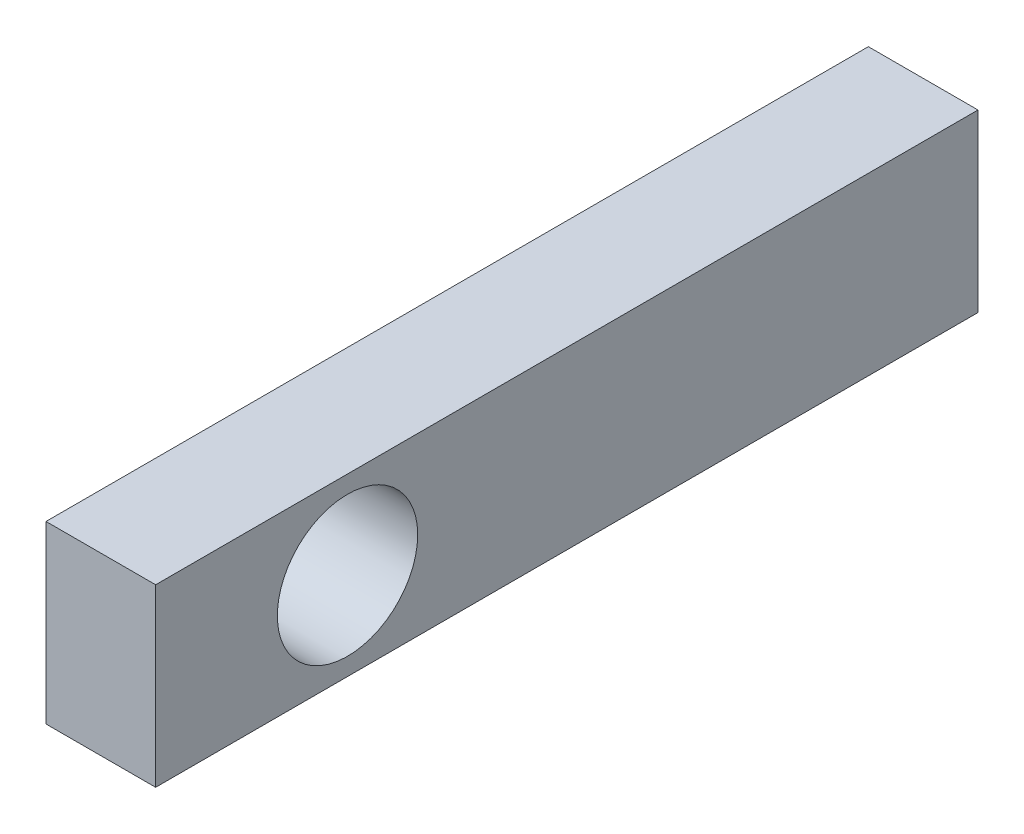
ISO-10303-21;
HEADER;
FILE_DESCRIPTION(('STEP AP214'),'2;1');
FILE_NAME('part.step','',(''),(''),'','','');
FILE_SCHEMA(('AUTOMOTIVE_DESIGN { 1 0 10303 214 1 1 1 1 }'));
ENDSEC;
DATA;
#1=APPLICATION_CONTEXT('core data for automotive mechanical design processes');
#2=APPLICATION_PROTOCOL_DEFINITION('international standard','automotive_design',2000,#1);
#3=PRODUCT_CONTEXT('',#1,'mechanical');
#4=PRODUCT('Part','Part','',(#3));
#5=PRODUCT_RELATED_PRODUCT_CATEGORY('part','',(#4));
#6=PRODUCT_DEFINITION_FORMATION('','',#4);
#7=PRODUCT_DEFINITION_CONTEXT('part definition',#1,'design');
#8=PRODUCT_DEFINITION('design','',#6,#7);
#9=PRODUCT_DEFINITION_SHAPE('','',#8);
#10=(LENGTH_UNIT() NAMED_UNIT(*) SI_UNIT(.MILLI.,.METRE.));
#11=(NAMED_UNIT(*) PLANE_ANGLE_UNIT() SI_UNIT($,.RADIAN.));
#12=(NAMED_UNIT(*) SI_UNIT($,.STERADIAN.) SOLID_ANGLE_UNIT());
#13=UNCERTAINTY_MEASURE_WITH_UNIT(LENGTH_MEASURE(1.E-05),#10,'distance_accuracy_value','');
#14=(GEOMETRIC_REPRESENTATION_CONTEXT(3) GLOBAL_UNCERTAINTY_ASSIGNED_CONTEXT((#13)) GLOBAL_UNIT_ASSIGNED_CONTEXT((#10,
#11,#12)) REPRESENTATION_CONTEXT('',''));
#15=CARTESIAN_POINT('',(0.,0.,0.));
#16=DIRECTION('',(0.,0.,1.));
#17=DIRECTION('',(1.,0.,0.));
#18=AXIS2_PLACEMENT_3D('',#15,#16,#17);
#19=CARTESIAN_POINT('',(0.,84.,57.));
#20=DIRECTION('',(1.,0.,0.));
#21=DIRECTION('',(0.,0.,-1.));
#22=AXIS2_PLACEMENT_3D('',#19,#20,#21);
#23=PLANE('',#22);
#24=CARTESIAN_POINT('',(0.,80.8,50.));
#25=DIRECTION('',(1.,0.,0.));
#26=DIRECTION('',(0.,0.,-1.));
#27=AXIS2_PLACEMENT_3D('',#24,#25,#26);
#28=CIRCLE('',#27,2.56);
#29=CARTESIAN_POINT('',(0.,80.8,47.44));
#30=VERTEX_POINT('',#29);
#31=EDGE_CURVE('E116',#30,#30,#28,.T.);
#32=ORIENTED_EDGE('',*,*,#31,.T.);
#33=EDGE_LOOP('',(#32));
#34=FACE_BOUND('',#33,.T.);
#35=DIRECTION('',(0.,-1.,0.));
#36=VECTOR('',#35,1.);
#37=CARTESIAN_POINT('',(0.,84.,27.));
#38=LINE('',#37,#36);
#39=CARTESIAN_POINT('',(0.,84.,27.));
#40=VERTEX_POINT('',#39);
#41=CARTESIAN_POINT('',(0.,77.6,27.));
#42=VERTEX_POINT('',#41);
#43=EDGE_CURVE('E105',#40,#42,#38,.T.);
#44=ORIENTED_EDGE('',*,*,#43,.T.);
#45=DIRECTION('',(0.,0.,-1.));
#46=VECTOR('',#45,1.);
#47=CARTESIAN_POINT('',(0.,77.6,57.));
#48=LINE('',#47,#46);
#49=CARTESIAN_POINT('',(0.,77.6,57.));
#50=VERTEX_POINT('',#49);
#51=EDGE_CURVE('E11',#50,#42,#48,.T.);
#52=ORIENTED_EDGE('',*,*,#51,.F.);
#53=DIRECTION('',(0.,-1.,0.));
#54=VECTOR('',#53,1.);
#55=CARTESIAN_POINT('',(0.,84.,57.));
#56=LINE('',#55,#54);
#57=CARTESIAN_POINT('',(0.,84.,57.));
#58=VERTEX_POINT('',#57);
#59=EDGE_CURVE('E88',#58,#50,#56,.T.);
#60=ORIENTED_EDGE('',*,*,#59,.F.);
#61=DIRECTION('',(0.,0.,-1.));
#62=VECTOR('',#61,1.);
#63=CARTESIAN_POINT('',(0.,84.,57.));
#64=LINE('',#63,#62);
#65=EDGE_CURVE('E96',#58,#40,#64,.T.);
#66=ORIENTED_EDGE('',*,*,#65,.T.);
#67=EDGE_LOOP('',(#44,#52,#60,#66));
#68=FACE_BOUND('',#67,.T.);
#69=ADVANCED_FACE('F39',(#34,#68),#23,.F.);
#70=CARTESIAN_POINT('',(0.,77.6,57.));
#71=DIRECTION('',(0.,1.,0.));
#72=DIRECTION('',(0.,0.,1.));
#73=AXIS2_PLACEMENT_3D('',#70,#71,#72);
#74=PLANE('',#73);
#75=DIRECTION('',(1.,0.,0.));
#76=VECTOR('',#75,1.);
#77=CARTESIAN_POINT('',(0.,77.6,27.));
#78=LINE('',#77,#76);
#79=CARTESIAN_POINT('',(4.,77.6,27.));
#80=VERTEX_POINT('',#79);
#81=EDGE_CURVE('E92',#42,#80,#78,.T.);
#82=ORIENTED_EDGE('',*,*,#81,.T.);
#83=DIRECTION('',(0.,0.,-1.));
#84=VECTOR('',#83,1.);
#85=CARTESIAN_POINT('',(4.,77.6,57.));
#86=LINE('',#85,#84);
#87=CARTESIAN_POINT('',(4.,77.6,57.));
#88=VERTEX_POINT('',#87);
#89=EDGE_CURVE('E50',#88,#80,#86,.T.);
#90=ORIENTED_EDGE('',*,*,#89,.F.);
#91=DIRECTION('',(1.,0.,0.));
#92=VECTOR('',#91,1.);
#93=CARTESIAN_POINT('',(0.,77.6,57.));
#94=LINE('',#93,#92);
#95=EDGE_CURVE('E81',#50,#88,#94,.T.);
#96=ORIENTED_EDGE('',*,*,#95,.F.);
#97=ORIENTED_EDGE('',*,*,#51,.T.);
#98=EDGE_LOOP('',(#82,#90,#96,#97));
#99=FACE_BOUND('',#98,.T.);
#100=ADVANCED_FACE('F91',(#99),#74,.F.);
#101=CARTESIAN_POINT('',(4.,77.6,57.));
#102=DIRECTION('',(-1.,0.,0.));
#103=DIRECTION('',(0.,0.,1.));
#104=AXIS2_PLACEMENT_3D('',#101,#102,#103);
#105=PLANE('',#104);
#106=CARTESIAN_POINT('',(4.,80.8,50.));
#107=DIRECTION('',(1.,0.,0.));
#108=DIRECTION('',(0.,0.,-1.));
#109=AXIS2_PLACEMENT_3D('',#106,#107,#108);
#110=CIRCLE('',#109,2.56);
#111=CARTESIAN_POINT('',(4.,80.8,47.44));
#112=VERTEX_POINT('',#111);
#113=EDGE_CURVE('E102',#112,#112,#110,.T.);
#114=ORIENTED_EDGE('',*,*,#113,.F.);
#115=EDGE_LOOP('',(#114));
#116=FACE_BOUND('',#115,.T.);
#117=DIRECTION('',(0.,1.,0.));
#118=VECTOR('',#117,1.);
#119=CARTESIAN_POINT('',(4.,77.6,27.));
#120=LINE('',#119,#118);
#121=CARTESIAN_POINT('',(4.,84.,27.));
#122=VERTEX_POINT('',#121);
#123=EDGE_CURVE('E75',#80,#122,#120,.T.);
#124=ORIENTED_EDGE('',*,*,#123,.T.);
#125=DIRECTION('',(0.,0.,-1.));
#126=VECTOR('',#125,1.);
#127=CARTESIAN_POINT('',(4.,84.,57.));
#128=LINE('',#127,#126);
#129=CARTESIAN_POINT('',(4.,84.,57.));
#130=VERTEX_POINT('',#129);
#131=EDGE_CURVE('E94',#130,#122,#128,.T.);
#132=ORIENTED_EDGE('',*,*,#131,.F.);
#133=DIRECTION('',(0.,1.,0.));
#134=VECTOR('',#133,1.);
#135=CARTESIAN_POINT('',(4.,77.6,57.));
#136=LINE('',#135,#134);
#137=EDGE_CURVE('E89',#88,#130,#136,.T.);
#138=ORIENTED_EDGE('',*,*,#137,.F.);
#139=ORIENTED_EDGE('',*,*,#89,.T.);
#140=EDGE_LOOP('',(#124,#132,#138,#139));
#141=FACE_BOUND('',#140,.T.);
#142=ADVANCED_FACE('F98',(#116,#141),#105,.F.);
#143=CARTESIAN_POINT('',(4.,84.,57.));
#144=DIRECTION('',(0.,-1.,0.));
#145=DIRECTION('',(0.,0.,-1.));
#146=AXIS2_PLACEMENT_3D('',#143,#144,#145);
#147=PLANE('',#146);
#148=DIRECTION('',(-1.,0.,0.));
#149=VECTOR('',#148,1.);
#150=CARTESIAN_POINT('',(4.,84.,27.));
#151=LINE('',#150,#149);
#152=EDGE_CURVE('E76',#122,#40,#151,.T.);
#153=ORIENTED_EDGE('',*,*,#152,.T.);
#154=ORIENTED_EDGE('',*,*,#65,.F.);
#155=DIRECTION('',(-1.,0.,0.));
#156=VECTOR('',#155,1.);
#157=CARTESIAN_POINT('',(4.,84.,57.));
#158=LINE('',#157,#156);
#159=EDGE_CURVE('E54',#130,#58,#158,.T.);
#160=ORIENTED_EDGE('',*,*,#159,.F.);
#161=ORIENTED_EDGE('',*,*,#131,.T.);
#162=EDGE_LOOP('',(#153,#154,#160,#161));
#163=FACE_BOUND('',#162,.T.);
#164=ADVANCED_FACE('F109',(#163),#147,.F.);
#165=CARTESIAN_POINT('',(0.,0.,57.));
#166=DIRECTION('',(0.,0.,1.));
#167=DIRECTION('',(1.,0.,0.));
#168=AXIS2_PLACEMENT_3D('',#165,#166,#167);
#169=PLANE('',#168);
#170=ORIENTED_EDGE('',*,*,#59,.T.);
#171=ORIENTED_EDGE('',*,*,#95,.T.);
#172=ORIENTED_EDGE('',*,*,#137,.T.);
#173=ORIENTED_EDGE('',*,*,#159,.T.);
#174=EDGE_LOOP('',(#170,#171,#172,#173));
#175=FACE_BOUND('',#174,.T.);
#176=ADVANCED_FACE('F87',(#175),#169,.T.);
#177=CARTESIAN_POINT('',(0.,0.,27.));
#178=DIRECTION('',(0.,0.,1.));
#179=DIRECTION('',(1.,0.,0.));
#180=AXIS2_PLACEMENT_3D('',#177,#178,#179);
#181=PLANE('',#180);
#182=ORIENTED_EDGE('',*,*,#43,.F.);
#183=ORIENTED_EDGE('',*,*,#152,.F.);
#184=ORIENTED_EDGE('',*,*,#123,.F.);
#185=ORIENTED_EDGE('',*,*,#81,.F.);
#186=EDGE_LOOP('',(#182,#183,#184,#185));
#187=FACE_BOUND('',#186,.T.);
#188=ADVANCED_FACE('F113',(#187),#181,.F.);
#189=CARTESIAN_POINT('',(4.,80.8,50.));
#190=DIRECTION('',(-1.,0.,0.));
#191=DIRECTION('',(0.,0.,1.));
#192=AXIS2_PLACEMENT_3D('',#189,#190,#191);
#193=CYLINDRICAL_SURFACE('',#192,2.56);
#194=ORIENTED_EDGE('',*,*,#113,.T.);
#195=EDGE_LOOP('',(#194));
#196=FACE_BOUND('',#195,.T.);
#197=ORIENTED_EDGE('',*,*,#31,.F.);
#198=EDGE_LOOP('',(#197));
#199=FACE_BOUND('',#198,.T.);
#200=ADVANCED_FACE('F125',(#196,#199),#193,.F.);
#201=CLOSED_SHELL('',(#69,#100,#142,#164,#176,#188,#200));
#202=MANIFOLD_SOLID_BREP('B2',#201);
#203=ADVANCED_BREP_SHAPE_REPRESENTATION('',(#18,#202),#14);
#204=SHAPE_DEFINITION_REPRESENTATION(#9,#203);
ENDSEC;
END-ISO-10303-21;
